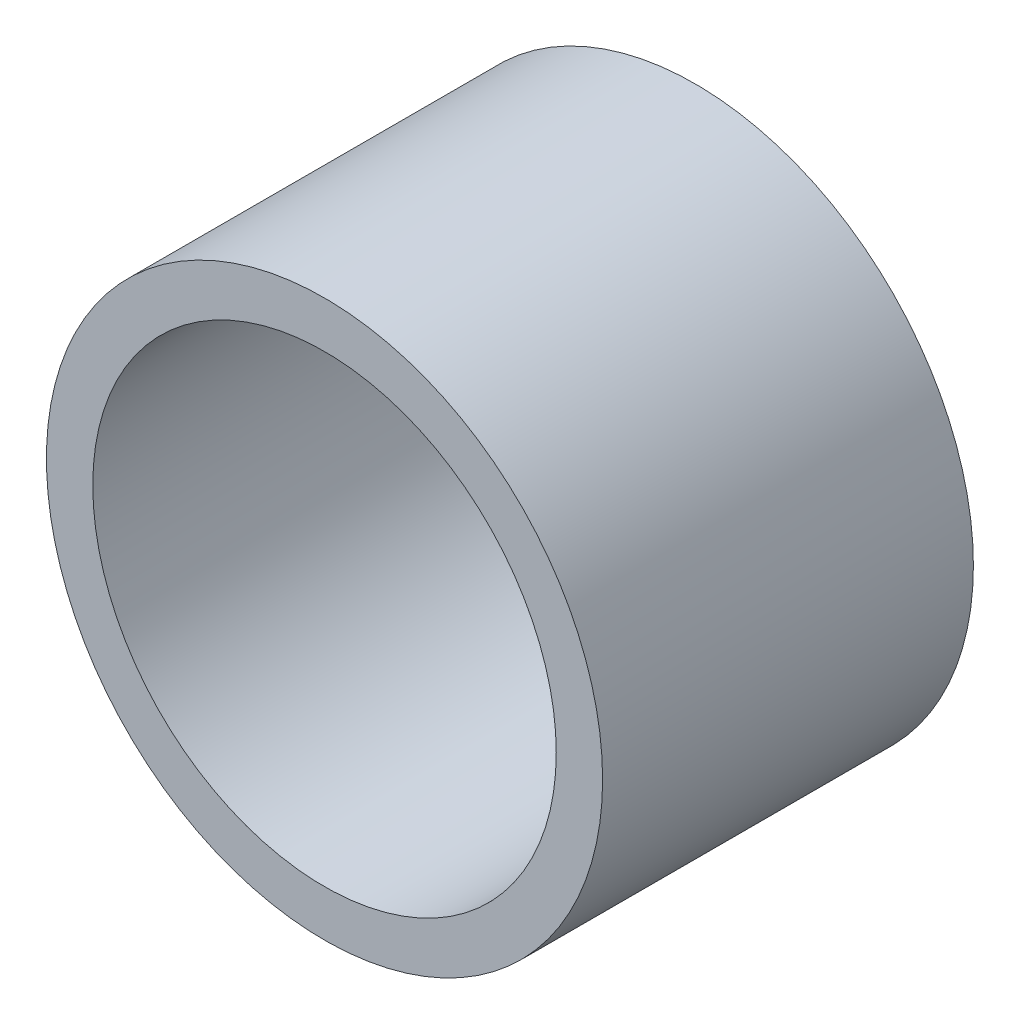
ISO-10303-21;
HEADER;
FILE_DESCRIPTION(('STEP AP214'),'2;1');
FILE_NAME('part.step','',(''),(''),'','','');
FILE_SCHEMA(('AUTOMOTIVE_DESIGN { 1 0 10303 214 1 1 1 1 }'));
ENDSEC;
DATA;
#1=APPLICATION_CONTEXT('core data for automotive mechanical design processes');
#2=APPLICATION_PROTOCOL_DEFINITION('international standard','automotive_design',2000,#1);
#3=PRODUCT_CONTEXT('',#1,'mechanical');
#4=PRODUCT('Part','Part','',(#3));
#5=PRODUCT_RELATED_PRODUCT_CATEGORY('part','',(#4));
#6=PRODUCT_DEFINITION_FORMATION('','',#4);
#7=PRODUCT_DEFINITION_CONTEXT('part definition',#1,'design');
#8=PRODUCT_DEFINITION('design','',#6,#7);
#9=PRODUCT_DEFINITION_SHAPE('','',#8);
#10=(LENGTH_UNIT() NAMED_UNIT(*) SI_UNIT(.MILLI.,.METRE.));
#11=(NAMED_UNIT(*) PLANE_ANGLE_UNIT() SI_UNIT($,.RADIAN.));
#12=(NAMED_UNIT(*) SI_UNIT($,.STERADIAN.) SOLID_ANGLE_UNIT());
#13=UNCERTAINTY_MEASURE_WITH_UNIT(LENGTH_MEASURE(1.E-05),#10,'distance_accuracy_value','');
#14=(GEOMETRIC_REPRESENTATION_CONTEXT(3) GLOBAL_UNCERTAINTY_ASSIGNED_CONTEXT((#13)) GLOBAL_UNIT_ASSIGNED_CONTEXT((#10,
#11,#12)) REPRESENTATION_CONTEXT('',''));
#15=CARTESIAN_POINT('',(0.,0.,0.));
#16=DIRECTION('',(0.,0.,1.));
#17=DIRECTION('',(1.,0.,0.));
#18=AXIS2_PLACEMENT_3D('',#15,#16,#17);
#19=CARTESIAN_POINT('',(0.,0.,8.));
#20=DIRECTION('',(0.,0.,1.));
#21=DIRECTION('',(1.,0.,0.));
#22=AXIS2_PLACEMENT_3D('',#19,#20,#21);
#23=PLANE('',#22);
#24=CARTESIAN_POINT('',(0.,0.,8.));
#25=DIRECTION('',(0.,0.,1.));
#26=DIRECTION('',(1.,0.,0.));
#27=AXIS2_PLACEMENT_3D('',#24,#25,#26);
#28=CIRCLE('',#27,6.);
#29=CARTESIAN_POINT('',(6.,0.,8.));
#30=VERTEX_POINT('',#29);
#31=EDGE_CURVE('E10',#30,#30,#28,.T.);
#32=ORIENTED_EDGE('',*,*,#31,.T.);
#33=EDGE_LOOP('',(#32));
#34=FACE_BOUND('',#33,.T.);
#35=CARTESIAN_POINT('',(0.,0.,8.));
#36=DIRECTION('',(0.,0.,1.));
#37=DIRECTION('',(1.,0.,0.));
#38=AXIS2_PLACEMENT_3D('',#35,#36,#37);
#39=CIRCLE('',#38,5.);
#40=CARTESIAN_POINT('',(5.,0.,8.));
#41=VERTEX_POINT('',#40);
#42=EDGE_CURVE('E50',#41,#41,#39,.T.);
#43=ORIENTED_EDGE('',*,*,#42,.F.);
#44=EDGE_LOOP('',(#43));
#45=FACE_BOUND('',#44,.T.);
#46=ADVANCED_FACE('F37',(#34,#45),#23,.T.);
#47=CARTESIAN_POINT('',(0.,0.,0.));
#48=DIRECTION('',(0.,0.,1.));
#49=DIRECTION('',(1.,0.,0.));
#50=AXIS2_PLACEMENT_3D('',#47,#48,#49);
#51=PLANE('',#50);
#52=CARTESIAN_POINT('',(0.,0.,0.));
#53=DIRECTION('',(0.,0.,1.));
#54=DIRECTION('',(1.,0.,0.));
#55=AXIS2_PLACEMENT_3D('',#52,#53,#54);
#56=CIRCLE('',#55,6.);
#57=CARTESIAN_POINT('',(6.,0.,0.));
#58=VERTEX_POINT('',#57);
#59=EDGE_CURVE('E41',#58,#58,#56,.T.);
#60=ORIENTED_EDGE('',*,*,#59,.F.);
#61=EDGE_LOOP('',(#60));
#62=FACE_BOUND('',#61,.T.);
#63=CARTESIAN_POINT('',(0.,0.,0.));
#64=DIRECTION('',(0.,0.,1.));
#65=DIRECTION('',(1.,0.,0.));
#66=AXIS2_PLACEMENT_3D('',#63,#64,#65);
#67=CIRCLE('',#66,5.);
#68=CARTESIAN_POINT('',(5.,0.,0.));
#69=VERTEX_POINT('',#68);
#70=EDGE_CURVE('E52',#69,#69,#67,.T.);
#71=ORIENTED_EDGE('',*,*,#70,.T.);
#72=EDGE_LOOP('',(#71));
#73=FACE_BOUND('',#72,.T.);
#74=ADVANCED_FACE('F64',(#62,#73),#51,.F.);
#75=CARTESIAN_POINT('',(0.,0.,8.));
#76=DIRECTION('',(0.,0.,-1.));
#77=DIRECTION('',(-1.,0.,0.));
#78=AXIS2_PLACEMENT_3D('',#75,#76,#77);
#79=CYLINDRICAL_SURFACE('',#78,6.);
#80=ORIENTED_EDGE('',*,*,#31,.F.);
#81=EDGE_LOOP('',(#80));
#82=FACE_BOUND('',#81,.T.);
#83=ORIENTED_EDGE('',*,*,#59,.T.);
#84=EDGE_LOOP('',(#83));
#85=FACE_BOUND('',#84,.T.);
#86=ADVANCED_FACE('F39',(#82,#85),#79,.T.);
#87=CARTESIAN_POINT('',(0.,0.,8.));
#88=DIRECTION('',(0.,0.,-1.));
#89=DIRECTION('',(-1.,0.,0.));
#90=AXIS2_PLACEMENT_3D('',#87,#88,#89);
#91=CYLINDRICAL_SURFACE('',#90,5.);
#92=ORIENTED_EDGE('',*,*,#42,.T.);
#93=EDGE_LOOP('',(#92));
#94=FACE_BOUND('',#93,.T.);
#95=ORIENTED_EDGE('',*,*,#70,.F.);
#96=EDGE_LOOP('',(#95));
#97=FACE_BOUND('',#96,.T.);
#98=ADVANCED_FACE('F60',(#94,#97),#91,.F.);
#99=CLOSED_SHELL('',(#46,#74,#86,#98));
#100=MANIFOLD_SOLID_BREP('B2',#99);
#101=ADVANCED_BREP_SHAPE_REPRESENTATION('',(#18,#100),#14);
#102=SHAPE_DEFINITION_REPRESENTATION(#9,#101);
ENDSEC;
END-ISO-10303-21;
